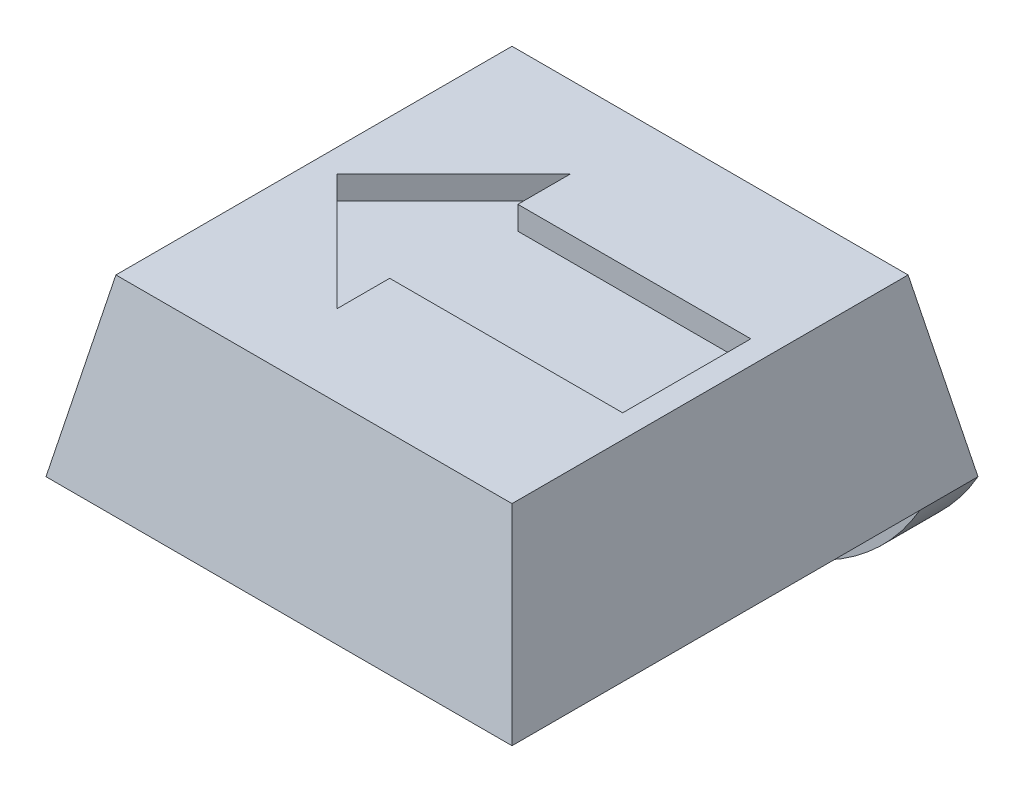
ISO-10303-21;
HEADER;
FILE_DESCRIPTION(('STEP AP214'),'2;1');
FILE_NAME('part.step','',(''),(''),'','','');
FILE_SCHEMA(('AUTOMOTIVE_DESIGN { 1 0 10303 214 1 1 1 1 }'));
ENDSEC;
DATA;
#1=APPLICATION_CONTEXT('core data for automotive mechanical design processes');
#2=APPLICATION_PROTOCOL_DEFINITION('international standard','automotive_design',2000,#1);
#3=PRODUCT_CONTEXT('',#1,'mechanical');
#4=PRODUCT('Part','Part','',(#3));
#5=PRODUCT_RELATED_PRODUCT_CATEGORY('part','',(#4));
#6=PRODUCT_DEFINITION_FORMATION('','',#4);
#7=PRODUCT_DEFINITION_CONTEXT('part definition',#1,'design');
#8=PRODUCT_DEFINITION('design','',#6,#7);
#9=PRODUCT_DEFINITION_SHAPE('','',#8);
#10=(LENGTH_UNIT() NAMED_UNIT(*) SI_UNIT(.MILLI.,.METRE.));
#11=(NAMED_UNIT(*) PLANE_ANGLE_UNIT() SI_UNIT($,.RADIAN.));
#12=(NAMED_UNIT(*) SI_UNIT($,.STERADIAN.) SOLID_ANGLE_UNIT());
#13=UNCERTAINTY_MEASURE_WITH_UNIT(LENGTH_MEASURE(1.E-05),#10,'distance_accuracy_value','');
#14=(GEOMETRIC_REPRESENTATION_CONTEXT(3) GLOBAL_UNCERTAINTY_ASSIGNED_CONTEXT((#13)) GLOBAL_UNIT_ASSIGNED_CONTEXT((#10,
#11,#12)) REPRESENTATION_CONTEXT('',''));
#15=CARTESIAN_POINT('',(0.,0.,0.));
#16=DIRECTION('',(0.,0.,1.));
#17=DIRECTION('',(1.,0.,0.));
#18=AXIS2_PLACEMENT_3D('',#15,#16,#17);
#19=CARTESIAN_POINT('',(0.,3.,0.));
#20=DIRECTION('',(0.,-1.,0.));
#21=DIRECTION('',(0.,0.,-1.));
#22=AXIS2_PLACEMENT_3D('',#19,#20,#21);
#23=PLANE('',#22);
#24=DIRECTION('',(0.,0.,-1.));
#25=VECTOR('',#24,1.);
#26=CARTESIAN_POINT('',(3.,3.,0.));
#27=LINE('',#26,#25);
#28=CARTESIAN_POINT('',(3.,3.,-2.));
#29=VERTEX_POINT('',#28);
#30=CARTESIAN_POINT('',(3.,3.,-2.9));
#31=VERTEX_POINT('',#30);
#32=EDGE_CURVE('E177',#29,#31,#27,.T.);
#33=ORIENTED_EDGE('',*,*,#32,.F.);
#34=DIRECTION('',(0.707106781186548,0.,0.707106781186547));
#35=VECTOR('',#34,1.);
#36=CARTESIAN_POINT('',(2.5,3.,-2.5));
#37=LINE('',#36,#35);
#38=CARTESIAN_POINT('',(1.,3.,-4.));
#39=VERTEX_POINT('',#38);
#40=EDGE_CURVE('E55',#39,#29,#37,.T.);
#41=ORIENTED_EDGE('',*,*,#40,.F.);
#42=DIRECTION('',(-0.707106781186548,0.,0.707106781186548));
#43=VECTOR('',#42,1.);
#44=CARTESIAN_POINT('',(-1.5,3.,-1.5));
#45=LINE('',#44,#43);
#46=CARTESIAN_POINT('',(3.,3.,-6.));
#47=VERTEX_POINT('',#46);
#48=EDGE_CURVE('E164',#47,#39,#45,.T.);
#49=ORIENTED_EDGE('',*,*,#48,.F.);
#50=CARTESIAN_POINT('',(3.,3.,-5.1));
#51=VERTEX_POINT('',#50);
#52=EDGE_CURVE('E167',#51,#47,#27,.T.);
#53=ORIENTED_EDGE('',*,*,#52,.F.);
#54=DIRECTION('',(1.,0.,0.));
#55=VECTOR('',#54,1.);
#56=CARTESIAN_POINT('',(0.,3.,-5.1));
#57=LINE('',#56,#55);
#58=CARTESIAN_POINT('',(7.,3.,-5.1));
#59=VERTEX_POINT('',#58);
#60=EDGE_CURVE('E185',#51,#59,#57,.T.);
#61=ORIENTED_EDGE('',*,*,#60,.T.);
#62=DIRECTION('',(0.,0.,1.));
#63=VECTOR('',#62,1.);
#64=CARTESIAN_POINT('',(7.,3.,0.));
#65=LINE('',#64,#63);
#66=CARTESIAN_POINT('',(7.,3.,-2.9));
#67=VERTEX_POINT('',#66);
#68=EDGE_CURVE('E182',#59,#67,#65,.T.);
#69=ORIENTED_EDGE('',*,*,#68,.T.);
#70=DIRECTION('',(1.,0.,0.));
#71=VECTOR('',#70,1.);
#72=CARTESIAN_POINT('',(0.,3.,-2.9));
#73=LINE('',#72,#71);
#74=EDGE_CURVE('E179',#31,#67,#73,.T.);
#75=ORIENTED_EDGE('',*,*,#74,.F.);
#76=EDGE_LOOP('',(#33,#41,#49,#53,#61,#69,#75));
#77=FACE_BOUND('',#76,.T.);
#78=DIRECTION('',(-1.,0.,0.));
#79=VECTOR('',#78,1.);
#80=CARTESIAN_POINT('',(11.,3.,-0.6));
#81=LINE('',#80,#79);
#82=CARTESIAN_POINT('',(7.4,3.,-0.6));
#83=VERTEX_POINT('',#82);
#84=CARTESIAN_POINT('',(0.6,3.,-0.6));
#85=VERTEX_POINT('',#84);
#86=EDGE_CURVE('E216',#83,#85,#81,.T.);
#87=ORIENTED_EDGE('',*,*,#86,.F.);
#88=DIRECTION('',(0.,0.,1.));
#89=VECTOR('',#88,1.);
#90=CARTESIAN_POINT('',(7.4,3.,-8.));
#91=LINE('',#90,#89);
#92=CARTESIAN_POINT('',(7.4,3.,-7.4));
#93=VERTEX_POINT('',#92);
#94=EDGE_CURVE('E225',#93,#83,#91,.T.);
#95=ORIENTED_EDGE('',*,*,#94,.F.);
#96=DIRECTION('',(-1.,0.,0.));
#97=VECTOR('',#96,1.);
#98=CARTESIAN_POINT('',(11.,3.,-7.4));
#99=LINE('',#98,#97);
#100=CARTESIAN_POINT('',(0.599999999999999,3.,-7.4));
#101=VERTEX_POINT('',#100);
#102=EDGE_CURVE('E213',#93,#101,#99,.T.);
#103=ORIENTED_EDGE('',*,*,#102,.T.);
#104=DIRECTION('',(0.,0.,1.));
#105=VECTOR('',#104,1.);
#106=CARTESIAN_POINT('',(0.6,3.,-8.));
#107=LINE('',#106,#105);
#108=EDGE_CURVE('E228',#101,#85,#107,.T.);
#109=ORIENTED_EDGE('',*,*,#108,.T.);
#110=EDGE_LOOP('',(#87,#95,#103,#109));
#111=FACE_BOUND('',#110,.T.);
#112=ADVANCED_FACE('F40',(#77,#111),#23,.F.);
#113=CARTESIAN_POINT('',(8.,0.,-8.));
#114=DIRECTION('',(-0.98058067569092,-0.196116135138184,0.));
#115=DIRECTION('',(0.196116135138184,-0.98058067569092,0.));
#116=AXIS2_PLACEMENT_3D('',#113,#114,#115);
#117=PLANE('',#116);
#118=DIRECTION('',(-0.192450089729875,0.962250448649376,-0.192450089729875));
#119=VECTOR('',#118,1.);
#120=CARTESIAN_POINT('',(7.7037037037037,1.48148148148148,-0.296296296296296));
#121=LINE('',#120,#119);
#122=CARTESIAN_POINT('',(8.,0.,0.));
#123=VERTEX_POINT('',#122);
#124=EDGE_CURVE('E223',#123,#83,#121,.T.);
#125=ORIENTED_EDGE('',*,*,#124,.F.);
#126=DIRECTION('',(0.,0.,-1.));
#127=VECTOR('',#126,1.);
#128=CARTESIAN_POINT('',(8.,0.,0.));
#129=LINE('',#128,#127);
#130=CARTESIAN_POINT('',(8.,0.,-7.));
#131=VERTEX_POINT('',#130);
#132=EDGE_CURVE('E238',#123,#131,#129,.T.);
#133=ORIENTED_EDGE('',*,*,#132,.T.);
#134=DIRECTION('',(0.,0.,1.));
#135=VECTOR('',#134,1.);
#136=CARTESIAN_POINT('',(8.,0.,-8.));
#137=LINE('',#136,#135);
#138=CARTESIAN_POINT('',(8.,0.,-8.));
#139=VERTEX_POINT('',#138);
#140=EDGE_CURVE('E190',#139,#131,#137,.T.);
#141=ORIENTED_EDGE('',*,*,#140,.F.);
#142=DIRECTION('',(0.192450089729875,-0.962250448649376,-0.192450089729875));
#143=VECTOR('',#142,1.);
#144=CARTESIAN_POINT('',(8.,0.,-8.));
#145=LINE('',#144,#143);
#146=EDGE_CURVE('E218',#93,#139,#145,.T.);
#147=ORIENTED_EDGE('',*,*,#146,.F.);
#148=ORIENTED_EDGE('',*,*,#94,.T.);
#149=EDGE_LOOP('',(#125,#133,#141,#147,#148));
#150=FACE_BOUND('',#149,.T.);
#151=ADVANCED_FACE('F296',(#150),#117,.F.);
#152=CARTESIAN_POINT('',(0.,0.,-8.));
#153=DIRECTION('',(0.98058067569092,-0.196116135138184,0.));
#154=DIRECTION('',(0.196116135138184,0.98058067569092,0.));
#155=AXIS2_PLACEMENT_3D('',#152,#153,#154);
#156=PLANE('',#155);
#157=DIRECTION('',(-0.192450089729875,-0.962250448649376,0.192450089729875));
#158=VECTOR('',#157,1.);
#159=CARTESIAN_POINT('',(0.296296296296296,1.48148148148148,-0.296296296296296));
#160=LINE('',#159,#158);
#161=CARTESIAN_POINT('',(0.,0.,0.));
#162=VERTEX_POINT('',#161);
#163=EDGE_CURVE('E261',#85,#162,#160,.T.);
#164=ORIENTED_EDGE('',*,*,#163,.F.);
#165=ORIENTED_EDGE('',*,*,#108,.F.);
#166=DIRECTION('',(0.192450089729875,0.962250448649376,0.192450089729875));
#167=VECTOR('',#166,1.);
#168=CARTESIAN_POINT('',(0.,0.,-8.));
#169=LINE('',#168,#167);
#170=CARTESIAN_POINT('',(0.,0.,-8.));
#171=VERTEX_POINT('',#170);
#172=EDGE_CURVE('E237',#171,#101,#169,.T.);
#173=ORIENTED_EDGE('',*,*,#172,.F.);
#174=DIRECTION('',(0.,0.,1.));
#175=VECTOR('',#174,1.);
#176=CARTESIAN_POINT('',(0.,0.,0.));
#177=LINE('',#176,#175);
#178=CARTESIAN_POINT('',(0.,0.,-7.));
#179=VERTEX_POINT('',#178);
#180=EDGE_CURVE('E241',#171,#179,#177,.T.);
#181=ORIENTED_EDGE('',*,*,#180,.T.);
#182=EDGE_CURVE('E231',#179,#162,#177,.T.);
#183=ORIENTED_EDGE('',*,*,#182,.T.);
#184=EDGE_LOOP('',(#164,#165,#173,#181,#183));
#185=FACE_BOUND('',#184,.T.);
#186=ADVANCED_FACE('F281',(#185),#156,.F.);
#187=CARTESIAN_POINT('',(0.,0.,0.));
#188=DIRECTION('',(0.,-1.,0.));
#189=DIRECTION('',(0.,0.,-1.));
#190=AXIS2_PLACEMENT_3D('',#187,#188,#189);
#191=PLANE('',#190);
#192=DIRECTION('',(-1.,0.,0.));
#193=VECTOR('',#192,1.);
#194=CARTESIAN_POINT('',(0.,0.,-7.));
#195=LINE('',#194,#193);
#196=EDGE_CURVE('E204',#131,#179,#195,.T.);
#197=ORIENTED_EDGE('',*,*,#196,.F.);
#198=ORIENTED_EDGE('',*,*,#132,.F.);
#199=DIRECTION('',(1.,0.,0.));
#200=VECTOR('',#199,1.);
#201=CARTESIAN_POINT('',(0.,0.,0.));
#202=LINE('',#201,#200);
#203=EDGE_CURVE('E239',#162,#123,#202,.T.);
#204=ORIENTED_EDGE('',*,*,#203,.F.);
#205=ORIENTED_EDGE('',*,*,#182,.F.);
#206=EDGE_LOOP('',(#197,#198,#204,#205));
#207=FACE_BOUND('',#206,.T.);
#208=CARTESIAN_POINT('',(4.,0.,-3.75));
#209=DIRECTION('',(0.,-1.,0.));
#210=DIRECTION('',(0.,0.,-1.));
#211=AXIS2_PLACEMENT_3D('',#208,#209,#210);
#212=CIRCLE('',#211,1.8);
#213=CARTESIAN_POINT('',(4.,0.,-5.55));
#214=VERTEX_POINT('',#213);
#215=EDGE_CURVE('E206',#214,#214,#212,.T.);
#216=ORIENTED_EDGE('',*,*,#215,.F.);
#217=EDGE_LOOP('',(#216));
#218=FACE_BOUND('',#217,.T.);
#219=ADVANCED_FACE('F291',(#207,#218),#191,.T.);
#220=CARTESIAN_POINT('',(11.,3.,-7.4));
#221=DIRECTION('',(0.,0.196116135138184,-0.98058067569092));
#222=DIRECTION('',(0.,0.98058067569092,0.196116135138184));
#223=AXIS2_PLACEMENT_3D('',#220,#221,#222);
#224=PLANE('',#223);
#225=ORIENTED_EDGE('',*,*,#146,.T.);
#226=DIRECTION('',(-1.,0.,0.));
#227=VECTOR('',#226,1.);
#228=CARTESIAN_POINT('',(0.,0.,-8.));
#229=LINE('',#228,#227);
#230=EDGE_CURVE('E234',#139,#171,#229,.T.);
#231=ORIENTED_EDGE('',*,*,#230,.T.);
#232=ORIENTED_EDGE('',*,*,#172,.T.);
#233=ORIENTED_EDGE('',*,*,#102,.F.);
#234=EDGE_LOOP('',(#225,#231,#232,#233));
#235=FACE_BOUND('',#234,.T.);
#236=ADVANCED_FACE('F276',(#235),#224,.T.);
#237=CARTESIAN_POINT('',(11.,0.,0.));
#238=DIRECTION('',(0.,0.196116135138184,0.98058067569092));
#239=DIRECTION('',(0.,-0.98058067569092,0.196116135138184));
#240=AXIS2_PLACEMENT_3D('',#237,#238,#239);
#241=PLANE('',#240);
#242=ORIENTED_EDGE('',*,*,#124,.T.);
#243=ORIENTED_EDGE('',*,*,#86,.T.);
#244=ORIENTED_EDGE('',*,*,#163,.T.);
#245=ORIENTED_EDGE('',*,*,#203,.T.);
#246=EDGE_LOOP('',(#242,#243,#244,#245));
#247=FACE_BOUND('',#246,.T.);
#248=ADVANCED_FACE('F319',(#247),#241,.T.);
#249=CARTESIAN_POINT('',(4.,0.8,-3.75));
#250=DIRECTION('',(0.,-1.,0.));
#251=DIRECTION('',(0.,0.,-1.));
#252=AXIS2_PLACEMENT_3D('',#249,#250,#251);
#253=CYLINDRICAL_SURFACE('',#252,1.8);
#254=CARTESIAN_POINT('',(4.,0.8,-3.75));
#255=DIRECTION('',(0.,-1.,0.));
#256=DIRECTION('',(0.,0.,-1.));
#257=AXIS2_PLACEMENT_3D('',#254,#255,#256);
#258=CIRCLE('',#257,1.8);
#259=CARTESIAN_POINT('',(4.,0.8,-5.55));
#260=VERTEX_POINT('',#259);
#261=EDGE_CURVE('E210',#260,#260,#258,.T.);
#262=ORIENTED_EDGE('',*,*,#261,.F.);
#263=EDGE_LOOP('',(#262));
#264=FACE_BOUND('',#263,.T.);
#265=ORIENTED_EDGE('',*,*,#215,.T.);
#266=EDGE_LOOP('',(#265));
#267=FACE_BOUND('',#266,.T.);
#268=ADVANCED_FACE('F326',(#264,#267),#253,.F.);
#269=CARTESIAN_POINT('',(4.,0.8,-3.75));
#270=DIRECTION('',(0.,-1.,0.));
#271=DIRECTION('',(0.,0.,-1.));
#272=AXIS2_PLACEMENT_3D('',#269,#270,#271);
#273=PLANE('',#272);
#274=ORIENTED_EDGE('',*,*,#261,.T.);
#275=EDGE_LOOP('',(#274));
#276=FACE_BOUND('',#275,.T.);
#277=ADVANCED_FACE('F330',(#276),#273,.T.);
#278=CARTESIAN_POINT('',(0.,-2.,-8.));
#279=DIRECTION('',(0.,0.,1.));
#280=DIRECTION('',(1.,0.,0.));
#281=AXIS2_PLACEMENT_3D('',#278,#279,#280);
#282=PLANE('',#281);
#283=ORIENTED_EDGE('',*,*,#230,.F.);
#284=CARTESIAN_POINT('',(4.53589838486225,2.,-8.));
#285=DIRECTION('',(0.,0.,1.));
#286=DIRECTION('',(1.,0.,0.));
#287=AXIS2_PLACEMENT_3D('',#284,#285,#286);
#288=CIRCLE('',#287,4.);
#289=CARTESIAN_POINT('',(4.53589838486225,-2.,-8.));
#290=VERTEX_POINT('',#289);
#291=EDGE_CURVE('E11',#139,#290,#288,.F.);
#292=ORIENTED_EDGE('',*,*,#291,.T.);
#293=DIRECTION('',(1.,0.,0.));
#294=VECTOR('',#293,1.);
#295=CARTESIAN_POINT('',(0.,-2.,-8.));
#296=LINE('',#295,#294);
#297=CARTESIAN_POINT('',(3.46410161513775,-2.,-8.));
#298=VERTEX_POINT('',#297);
#299=EDGE_CURVE('E200',#298,#290,#296,.T.);
#300=ORIENTED_EDGE('',*,*,#299,.F.);
#301=CARTESIAN_POINT('',(3.46410161513775,2.,-8.));
#302=DIRECTION('',(0.,0.,1.));
#303=DIRECTION('',(1.,0.,0.));
#304=AXIS2_PLACEMENT_3D('',#301,#302,#303);
#305=CIRCLE('',#304,4.);
#306=EDGE_CURVE('E48',#298,#171,#305,.F.);
#307=ORIENTED_EDGE('',*,*,#306,.T.);
#308=EDGE_LOOP('',(#283,#292,#300,#307));
#309=FACE_BOUND('',#308,.T.);
#310=ADVANCED_FACE('F269',(#309),#282,.F.);
#311=CARTESIAN_POINT('',(0.,-2.,-7.));
#312=DIRECTION('',(0.,0.,-1.));
#313=DIRECTION('',(-1.,0.,0.));
#314=AXIS2_PLACEMENT_3D('',#311,#312,#313);
#315=PLANE('',#314);
#316=DIRECTION('',(-1.,0.,0.));
#317=VECTOR('',#316,1.);
#318=CARTESIAN_POINT('',(0.,-2.,-7.));
#319=LINE('',#318,#317);
#320=CARTESIAN_POINT('',(4.53589838486225,-2.,-7.));
#321=VERTEX_POINT('',#320);
#322=CARTESIAN_POINT('',(3.46410161513775,-2.,-7.));
#323=VERTEX_POINT('',#322);
#324=EDGE_CURVE('E203',#321,#323,#319,.T.);
#325=ORIENTED_EDGE('',*,*,#324,.F.);
#326=CARTESIAN_POINT('',(4.53589838486225,2.,-7.));
#327=DIRECTION('',(0.,0.,-1.));
#328=DIRECTION('',(-1.,0.,0.));
#329=AXIS2_PLACEMENT_3D('',#326,#327,#328);
#330=CIRCLE('',#329,4.);
#331=EDGE_CURVE('E265',#321,#131,#330,.F.);
#332=ORIENTED_EDGE('',*,*,#331,.T.);
#333=ORIENTED_EDGE('',*,*,#196,.T.);
#334=CARTESIAN_POINT('',(3.46410161513775,2.,-7.));
#335=DIRECTION('',(0.,0.,-1.));
#336=DIRECTION('',(-1.,0.,0.));
#337=AXIS2_PLACEMENT_3D('',#334,#335,#336);
#338=CIRCLE('',#337,4.);
#339=EDGE_CURVE('E63',#179,#323,#338,.F.);
#340=ORIENTED_EDGE('',*,*,#339,.T.);
#341=EDGE_LOOP('',(#325,#332,#333,#340));
#342=FACE_BOUND('',#341,.T.);
#343=ADVANCED_FACE('F286',(#342),#315,.F.);
#344=CARTESIAN_POINT('',(0.,-2.,0.));
#345=DIRECTION('',(0.,1.,0.));
#346=DIRECTION('',(0.,0.,1.));
#347=AXIS2_PLACEMENT_3D('',#344,#345,#346);
#348=PLANE('',#347);
#349=ORIENTED_EDGE('',*,*,#299,.T.);
#350=DIRECTION('',(0.,0.,1.));
#351=VECTOR('',#350,1.);
#352=CARTESIAN_POINT('',(4.53589838486225,-2.,0.));
#353=LINE('',#352,#351);
#354=EDGE_CURVE('E260',#290,#321,#353,.T.);
#355=ORIENTED_EDGE('',*,*,#354,.T.);
#356=ORIENTED_EDGE('',*,*,#324,.T.);
#357=DIRECTION('',(0.,0.,-1.));
#358=VECTOR('',#357,1.);
#359=CARTESIAN_POINT('',(3.46410161513775,-2.,0.));
#360=LINE('',#359,#358);
#361=EDGE_CURVE('E257',#323,#298,#360,.T.);
#362=ORIENTED_EDGE('',*,*,#361,.T.);
#363=EDGE_LOOP('',(#349,#355,#356,#362));
#364=FACE_BOUND('',#363,.T.);
#365=ADVANCED_FACE('F284',(#364),#348,.F.);
#366=CARTESIAN_POINT('',(4.53589838486225,2.,-8.));
#367=DIRECTION('',(0.,0.,1.));
#368=DIRECTION('',(1.,0.,0.));
#369=AXIS2_PLACEMENT_3D('',#366,#367,#368);
#370=CYLINDRICAL_SURFACE('',#369,4.);
#371=ORIENTED_EDGE('',*,*,#291,.F.);
#372=ORIENTED_EDGE('',*,*,#140,.T.);
#373=ORIENTED_EDGE('',*,*,#331,.F.);
#374=ORIENTED_EDGE('',*,*,#354,.F.);
#375=EDGE_LOOP('',(#371,#372,#373,#374));
#376=FACE_BOUND('',#375,.T.);
#377=ADVANCED_FACE('F297',(#376),#370,.T.);
#378=CARTESIAN_POINT('',(3.46410161513775,2.,-8.));
#379=DIRECTION('',(0.,0.,-1.));
#380=DIRECTION('',(-1.,0.,0.));
#381=AXIS2_PLACEMENT_3D('',#378,#379,#380);
#382=CYLINDRICAL_SURFACE('',#381,4.);
#383=ORIENTED_EDGE('',*,*,#339,.F.);
#384=ORIENTED_EDGE('',*,*,#180,.F.);
#385=ORIENTED_EDGE('',*,*,#306,.F.);
#386=ORIENTED_EDGE('',*,*,#361,.F.);
#387=EDGE_LOOP('',(#383,#384,#385,#386));
#388=FACE_BOUND('',#387,.T.);
#389=ADVANCED_FACE('F42',(#388),#382,.T.);
#390=CARTESIAN_POINT('',(2.5,2.6,-2.5));
#391=DIRECTION('',(-0.707106781186547,0.,0.707106781186548));
#392=DIRECTION('',(0.707106781186548,0.,0.707106781186547));
#393=AXIS2_PLACEMENT_3D('',#390,#391,#392);
#394=PLANE('',#393);
#395=ORIENTED_EDGE('',*,*,#40,.T.);
#396=DIRECTION('',(0.,1.,0.));
#397=VECTOR('',#396,1.);
#398=CARTESIAN_POINT('',(3.,2.6,-2.));
#399=LINE('',#398,#397);
#400=CARTESIAN_POINT('',(3.,2.6,-2.));
#401=VERTEX_POINT('',#400);
#402=EDGE_CURVE('E140',#401,#29,#399,.T.);
#403=ORIENTED_EDGE('',*,*,#402,.F.);
#404=DIRECTION('',(0.707106781186548,0.,0.707106781186547));
#405=VECTOR('',#404,1.);
#406=CARTESIAN_POINT('',(2.5,2.6,-2.5));
#407=LINE('',#406,#405);
#408=CARTESIAN_POINT('',(1.,2.6,-4.));
#409=VERTEX_POINT('',#408);
#410=EDGE_CURVE('E144',#409,#401,#407,.T.);
#411=ORIENTED_EDGE('',*,*,#410,.F.);
#412=DIRECTION('',(0.,1.,0.));
#413=VECTOR('',#412,1.);
#414=CARTESIAN_POINT('',(1.,2.6,-4.));
#415=LINE('',#414,#413);
#416=EDGE_CURVE('E188',#409,#39,#415,.T.);
#417=ORIENTED_EDGE('',*,*,#416,.T.);
#418=EDGE_LOOP('',(#395,#403,#411,#417));
#419=FACE_BOUND('',#418,.T.);
#420=ADVANCED_FACE('F142',(#419),#394,.F.);
#421=CARTESIAN_POINT('',(-1.5,2.6,-1.5));
#422=DIRECTION('',(-0.707106781186548,0.,-0.707106781186548));
#423=DIRECTION('',(-0.707106781186548,0.,0.707106781186548));
#424=AXIS2_PLACEMENT_3D('',#421,#422,#423);
#425=PLANE('',#424);
#426=ORIENTED_EDGE('',*,*,#48,.T.);
#427=ORIENTED_EDGE('',*,*,#416,.F.);
#428=DIRECTION('',(-0.707106781186548,0.,0.707106781186548));
#429=VECTOR('',#428,1.);
#430=CARTESIAN_POINT('',(-1.5,2.6,-1.5));
#431=LINE('',#430,#429);
#432=CARTESIAN_POINT('',(3.,2.6,-6.));
#433=VERTEX_POINT('',#432);
#434=EDGE_CURVE('E150',#433,#409,#431,.T.);
#435=ORIENTED_EDGE('',*,*,#434,.F.);
#436=DIRECTION('',(0.,1.,0.));
#437=VECTOR('',#436,1.);
#438=CARTESIAN_POINT('',(3.,2.6,-6.));
#439=LINE('',#438,#437);
#440=EDGE_CURVE('E191',#433,#47,#439,.T.);
#441=ORIENTED_EDGE('',*,*,#440,.T.);
#442=EDGE_LOOP('',(#426,#427,#435,#441));
#443=FACE_BOUND('',#442,.T.);
#444=ADVANCED_FACE('F341',(#443),#425,.F.);
#445=CARTESIAN_POINT('',(3.,2.6,0.));
#446=DIRECTION('',(1.,0.,0.));
#447=DIRECTION('',(0.,0.,-1.));
#448=AXIS2_PLACEMENT_3D('',#445,#446,#447);
#449=PLANE('',#448);
#450=ORIENTED_EDGE('',*,*,#52,.T.);
#451=ORIENTED_EDGE('',*,*,#440,.F.);
#452=DIRECTION('',(0.,0.,-1.));
#453=VECTOR('',#452,1.);
#454=CARTESIAN_POINT('',(3.,2.6,0.));
#455=LINE('',#454,#453);
#456=CARTESIAN_POINT('',(3.,2.6,-5.1));
#457=VERTEX_POINT('',#456);
#458=EDGE_CURVE('E160',#457,#433,#455,.T.);
#459=ORIENTED_EDGE('',*,*,#458,.F.);
#460=DIRECTION('',(0.,1.,0.));
#461=VECTOR('',#460,1.);
#462=CARTESIAN_POINT('',(3.,2.6,-5.1));
#463=LINE('',#462,#461);
#464=EDGE_CURVE('E193',#457,#51,#463,.T.);
#465=ORIENTED_EDGE('',*,*,#464,.T.);
#466=EDGE_LOOP('',(#450,#451,#459,#465));
#467=FACE_BOUND('',#466,.T.);
#468=ADVANCED_FACE('F353',(#467),#449,.F.);
#469=CARTESIAN_POINT('',(0.,2.6,-5.1));
#470=DIRECTION('',(0.,0.,1.));
#471=DIRECTION('',(1.,0.,0.));
#472=AXIS2_PLACEMENT_3D('',#469,#470,#471);
#473=PLANE('',#472);
#474=ORIENTED_EDGE('',*,*,#60,.F.);
#475=ORIENTED_EDGE('',*,*,#464,.F.);
#476=DIRECTION('',(1.,0.,0.));
#477=VECTOR('',#476,1.);
#478=CARTESIAN_POINT('',(0.,2.6,-5.1));
#479=LINE('',#478,#477);
#480=CARTESIAN_POINT('',(7.,2.6,-5.1));
#481=VERTEX_POINT('',#480);
#482=EDGE_CURVE('E173',#457,#481,#479,.T.);
#483=ORIENTED_EDGE('',*,*,#482,.T.);
#484=DIRECTION('',(0.,1.,0.));
#485=VECTOR('',#484,1.);
#486=CARTESIAN_POINT('',(7.,2.6,-5.1));
#487=LINE('',#486,#485);
#488=EDGE_CURVE('E195',#481,#59,#487,.T.);
#489=ORIENTED_EDGE('',*,*,#488,.T.);
#490=EDGE_LOOP('',(#474,#475,#483,#489));
#491=FACE_BOUND('',#490,.T.);
#492=ADVANCED_FACE('F349',(#491),#473,.T.);
#493=CARTESIAN_POINT('',(7.,2.6,0.));
#494=DIRECTION('',(-1.,0.,0.));
#495=DIRECTION('',(0.,0.,1.));
#496=AXIS2_PLACEMENT_3D('',#493,#494,#495);
#497=PLANE('',#496);
#498=ORIENTED_EDGE('',*,*,#68,.F.);
#499=ORIENTED_EDGE('',*,*,#488,.F.);
#500=DIRECTION('',(0.,0.,1.));
#501=VECTOR('',#500,1.);
#502=CARTESIAN_POINT('',(7.,2.6,0.));
#503=LINE('',#502,#501);
#504=CARTESIAN_POINT('',(7.,2.6,-2.9));
#505=VERTEX_POINT('',#504);
#506=EDGE_CURVE('E171',#481,#505,#503,.T.);
#507=ORIENTED_EDGE('',*,*,#506,.T.);
#508=DIRECTION('',(0.,1.,0.));
#509=VECTOR('',#508,1.);
#510=CARTESIAN_POINT('',(7.,2.6,-2.9));
#511=LINE('',#510,#509);
#512=EDGE_CURVE('E197',#505,#67,#511,.T.);
#513=ORIENTED_EDGE('',*,*,#512,.T.);
#514=EDGE_LOOP('',(#498,#499,#507,#513));
#515=FACE_BOUND('',#514,.T.);
#516=ADVANCED_FACE('F345',(#515),#497,.T.);
#517=CARTESIAN_POINT('',(0.,2.6,-2.9));
#518=DIRECTION('',(0.,0.,1.));
#519=DIRECTION('',(1.,0.,0.));
#520=AXIS2_PLACEMENT_3D('',#517,#518,#519);
#521=PLANE('',#520);
#522=ORIENTED_EDGE('',*,*,#74,.T.);
#523=ORIENTED_EDGE('',*,*,#512,.F.);
#524=DIRECTION('',(1.,0.,0.));
#525=VECTOR('',#524,1.);
#526=CARTESIAN_POINT('',(0.,2.6,-2.9));
#527=LINE('',#526,#525);
#528=CARTESIAN_POINT('',(3.,2.6,-2.9));
#529=VERTEX_POINT('',#528);
#530=EDGE_CURVE('E158',#529,#505,#527,.T.);
#531=ORIENTED_EDGE('',*,*,#530,.F.);
#532=DIRECTION('',(0.,1.,0.));
#533=VECTOR('',#532,1.);
#534=CARTESIAN_POINT('',(3.,2.6,-2.9));
#535=LINE('',#534,#533);
#536=EDGE_CURVE('E149',#529,#31,#535,.T.);
#537=ORIENTED_EDGE('',*,*,#536,.T.);
#538=EDGE_LOOP('',(#522,#523,#531,#537));
#539=FACE_BOUND('',#538,.T.);
#540=ADVANCED_FACE('F342',(#539),#521,.F.);
#541=ORIENTED_EDGE('',*,*,#32,.T.);
#542=ORIENTED_EDGE('',*,*,#536,.F.);
#543=EDGE_CURVE('E153',#401,#529,#455,.T.);
#544=ORIENTED_EDGE('',*,*,#543,.F.);
#545=ORIENTED_EDGE('',*,*,#402,.T.);
#546=EDGE_LOOP('',(#541,#542,#544,#545));
#547=FACE_BOUND('',#546,.T.);
#548=ADVANCED_FACE('F154',(#547),#449,.F.);
#549=CARTESIAN_POINT('',(0.,2.6,0.));
#550=DIRECTION('',(0.,1.,0.));
#551=DIRECTION('',(0.,0.,1.));
#552=AXIS2_PLACEMENT_3D('',#549,#550,#551);
#553=PLANE('',#552);
#554=ORIENTED_EDGE('',*,*,#410,.T.);
#555=ORIENTED_EDGE('',*,*,#543,.T.);
#556=ORIENTED_EDGE('',*,*,#530,.T.);
#557=ORIENTED_EDGE('',*,*,#506,.F.);
#558=ORIENTED_EDGE('',*,*,#482,.F.);
#559=ORIENTED_EDGE('',*,*,#458,.T.);
#560=ORIENTED_EDGE('',*,*,#434,.T.);
#561=EDGE_LOOP('',(#554,#555,#556,#557,#558,#559,#560));
#562=FACE_BOUND('',#561,.T.);
#563=ADVANCED_FACE('F161',(#562),#553,.T.);
#564=CLOSED_SHELL('',(#112,#151,#186,#219,#236,#248,#268,#277,#310,#343,#365,#377,#389,#420,
#444,#468,#492,#516,#540,#548,#563));
#565=MANIFOLD_SOLID_BREP('B2',#564);
#566=ADVANCED_BREP_SHAPE_REPRESENTATION('',(#18,#565),#14);
#567=SHAPE_DEFINITION_REPRESENTATION(#9,#566);
ENDSEC;
END-ISO-10303-21;
